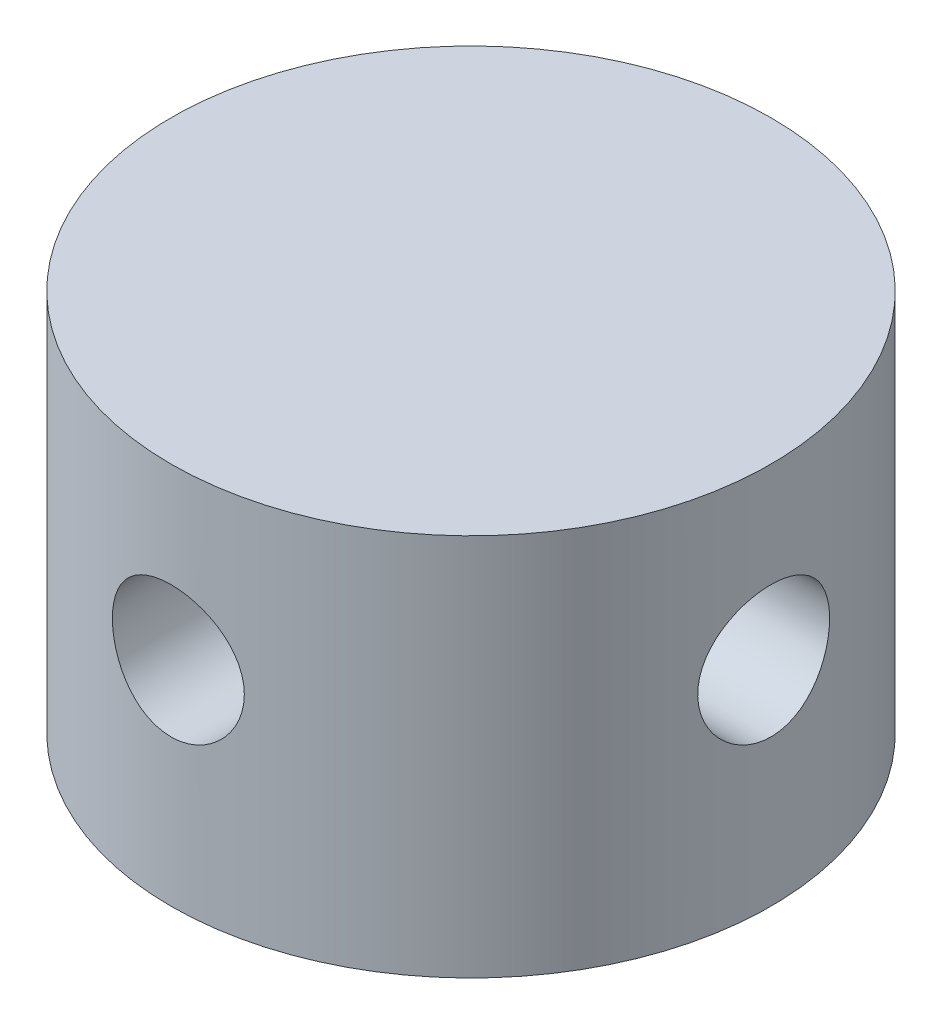
ISO-10303-21;
HEADER;
FILE_DESCRIPTION(('STEP AP214'),'2;1');
FILE_NAME('part.step','',(''),(''),'','','');
FILE_SCHEMA(('AUTOMOTIVE_DESIGN { 1 0 10303 214 1 1 1 1 }'));
ENDSEC;
DATA;
#1=APPLICATION_CONTEXT('core data for automotive mechanical design processes');
#2=APPLICATION_PROTOCOL_DEFINITION('international standard','automotive_design',2000,#1);
#3=PRODUCT_CONTEXT('',#1,'mechanical');
#4=PRODUCT('Part','Part','',(#3));
#5=PRODUCT_RELATED_PRODUCT_CATEGORY('part','',(#4));
#6=PRODUCT_DEFINITION_FORMATION('','',#4);
#7=PRODUCT_DEFINITION_CONTEXT('part definition',#1,'design');
#8=PRODUCT_DEFINITION('design','',#6,#7);
#9=PRODUCT_DEFINITION_SHAPE('','',#8);
#10=(LENGTH_UNIT() NAMED_UNIT(*) SI_UNIT(.MILLI.,.METRE.));
#11=(NAMED_UNIT(*) PLANE_ANGLE_UNIT() SI_UNIT($,.RADIAN.));
#12=(NAMED_UNIT(*) SI_UNIT($,.STERADIAN.) SOLID_ANGLE_UNIT());
#13=UNCERTAINTY_MEASURE_WITH_UNIT(LENGTH_MEASURE(1.E-05),#10,'distance_accuracy_value','');
#14=(GEOMETRIC_REPRESENTATION_CONTEXT(3) GLOBAL_UNCERTAINTY_ASSIGNED_CONTEXT((#13)) GLOBAL_UNIT_ASSIGNED_CONTEXT((#10,
#11,#12)) REPRESENTATION_CONTEXT('',''));
#15=CARTESIAN_POINT('',(0.,0.,0.));
#16=DIRECTION('',(0.,0.,1.));
#17=DIRECTION('',(1.,0.,0.));
#18=AXIS2_PLACEMENT_3D('',#15,#16,#17);
#19=CARTESIAN_POINT('',(0.,18.,0.));
#20=DIRECTION('',(0.,-1.,0.));
#21=DIRECTION('',(0.,0.,-1.));
#22=AXIS2_PLACEMENT_3D('',#19,#20,#21);
#23=CYLINDRICAL_SURFACE('',#22,14.1);
#24=CARTESIAN_POINT('',(3.09999999999995,9.99536264570849,13.7549990912395));
#25=CARTESIAN_POINT('',(3.09999411992978,9.82350746905944,13.7550025645096));
#26=CARTESIAN_POINT('',(3.08566065081584,9.65158181903695,13.7582549156995));
#27=CARTESIAN_POINT('',(3.02876920659056,9.3126213978908,13.7708886865632));
#28=CARTESIAN_POINT('',(2.98619096245082,9.14559022909433,13.7802745076685));
#29=CARTESIAN_POINT('',(2.87421678731367,8.82137098291792,13.8040620089077));
#30=CARTESIAN_POINT('',(2.80485045676283,8.66417226282665,13.8184581509814));
#31=CARTESIAN_POINT('',(2.64135406815421,8.3636395515444,13.8506375385802));
#32=CARTESIAN_POINT('',(2.54722446606408,8.22030530513245,13.8684207217379));
#33=CARTESIAN_POINT('',(2.33516105701524,7.94912198791013,13.9057095676612));
#34=CARTESIAN_POINT('',(2.2168844435982,7.82154399849603,13.9252374573557));
#35=CARTESIAN_POINT('',(1.96062442037141,7.58786928740143,13.9636208860314));
#36=CARTESIAN_POINT('',(1.82263947028193,7.48177424626149,13.9824763723176));
#37=CARTESIAN_POINT('',(1.52906082654924,7.29300353951631,14.0176326779998));
#38=CARTESIAN_POINT('',(1.37329555415371,7.21058879222852,14.0339042127536));
#39=CARTESIAN_POINT('',(1.04970870308235,7.07320646881902,14.0618081004196));
#40=CARTESIAN_POINT('',(0.881888494027424,7.01823578026641,14.0734409793716));
#41=CARTESIAN_POINT('',(0.541774438229651,6.93815511292983,14.0905997744071));
#42=CARTESIAN_POINT('',(0.369593436589872,6.9125862901946,14.0962194331246));
#43=CARTESIAN_POINT('',(0.0233002640244743,6.89060035151249,14.1010434578668));
#44=CARTESIAN_POINT('',(-0.150811681453886,6.89417986740183,14.1002485651092));
#45=CARTESIAN_POINT('',(-0.492860552600872,6.93004765789389,14.0924046293851));
#46=CARTESIAN_POINT('',(-0.660852177709911,6.96184133291502,14.0854633384897));
#47=CARTESIAN_POINT('',(-0.989055647430131,7.05244654404086,14.0662294023306));
#48=CARTESIAN_POINT('',(-1.14926713752524,7.11125931004489,14.0539365134654));
#49=CARTESIAN_POINT('',(-1.45873313752615,7.25466943493992,14.0252076372885));
#50=CARTESIAN_POINT('',(-1.6078980588268,7.3394538814269,14.0087417433553));
#51=CARTESIAN_POINT('',(-1.89006320955216,7.5322610596118,13.9734716605152));
#52=CARTESIAN_POINT('',(-2.02306121163649,7.64028698765707,13.954667150134));
#53=CARTESIAN_POINT('',(-2.27205912383892,7.87920200736506,13.9163204412336));
#54=CARTESIAN_POINT('',(-2.3876429603526,8.01052396047323,13.896771045125));
#55=CARTESIAN_POINT('',(-2.59522551407852,8.2908895026313,13.8595079162539));
#56=CARTESIAN_POINT('',(-2.68722357850058,8.4399335820145,13.841794234307));
#57=CARTESIAN_POINT('',(-2.84521072787002,8.75219011473823,13.8101888934495));
#58=CARTESIAN_POINT('',(-2.91112045202937,8.91544398454529,13.7963089348492));
#59=CARTESIAN_POINT('',(-3.01444437490898,9.25108792748183,13.7741042204203));
#60=CARTESIAN_POINT('',(-3.05186314580376,9.42347652993534,13.7657785732729));
#61=CARTESIAN_POINT('',(-3.09649608108288,9.76869267791968,13.7558071154172));
#62=CARTESIAN_POINT('',(-3.10431640026352,9.94143807402838,13.7540272731805));
#63=CARTESIAN_POINT('',(-3.0911721661921,10.2857643271728,13.7569872761586));
#64=CARTESIAN_POINT('',(-3.07020961254415,10.4573452642736,13.7617266684691));
#65=CARTESIAN_POINT('',(-3.00062079433947,10.7923566907622,13.7770644979956));
#66=CARTESIAN_POINT('',(-2.95232903572702,10.9558602095,13.7875920453895));
#67=CARTESIAN_POINT('',(-2.82981511824617,11.2724550765482,13.8132559309797));
#68=CARTESIAN_POINT('',(-2.75559045624442,11.4255454180381,13.8283927140573));
#69=CARTESIAN_POINT('',(-2.58198452157466,11.7195895355812,13.8618635923069));
#70=CARTESIAN_POINT('',(-2.48223022157287,11.8603177258924,13.8802437204791));
#71=CARTESIAN_POINT('',(-2.26088420495545,12.1232593707636,13.9180092019454));
#72=CARTESIAN_POINT('',(-2.13928974693735,12.2454704974857,13.9373946812148));
#73=CARTESIAN_POINT('',(-1.87497074612182,12.4702651599714,13.975428852107));
#74=CARTESIAN_POINT('',(-1.7318910619015,12.572435225996,13.994056763232));
#75=CARTESIAN_POINT('',(-1.43024752478873,12.7512891802791,14.0280930395516));
#76=CARTESIAN_POINT('',(-1.27168439945086,12.8279742653116,14.0435015559163));
#77=CARTESIAN_POINT('',(-0.944567991158111,12.9531073789012,14.069275375524));
#78=CARTESIAN_POINT('',(-0.776086173026157,13.001735322924,14.0796727401135));
#79=CARTESIAN_POINT('',(-0.43309015269698,13.0699350115161,14.0943914435328));
#80=CARTESIAN_POINT('',(-0.258576840886444,13.0895110262266,14.0987136752992));
#81=CARTESIAN_POINT('',(0.0876046700024358,13.0988575091693,14.1007682619989));
#82=CARTESIAN_POINT('',(0.259255689059971,13.0892450476252,14.0986370510955));
#83=CARTESIAN_POINT('',(0.598431940291955,13.0418688251846,14.0883168803137));
#84=CARTESIAN_POINT('',(0.765957248072582,13.0041055805653,14.0801280315307));
#85=CARTESIAN_POINT('',(1.09164358500725,12.9017967513608,14.0586231715158));
#86=CARTESIAN_POINT('',(1.2498335570684,12.8373395184742,14.0453240845184));
#87=CARTESIAN_POINT('',(1.55323484095157,12.6835582438099,14.0150181722923));
#88=CARTESIAN_POINT('',(1.69844487706199,12.5942317613412,13.9980109831827));
#89=CARTESIAN_POINT('',(1.9747714825509,12.3912399850654,13.9617366823329));
#90=CARTESIAN_POINT('',(2.10556481223626,12.2771412567439,13.9424325219723));
#91=CARTESIAN_POINT('',(2.3463592071959,12.0287170021513,13.9039383823843));
#92=CARTESIAN_POINT('',(2.45635524609736,11.8943866002652,13.8847484318422));
#93=CARTESIAN_POINT('',(2.65386864398921,11.6071245511426,13.8483656087781));
#94=CARTESIAN_POINT('',(2.74106145435619,11.4539656573861,13.8312032969471));
#95=CARTESIAN_POINT('',(2.88833154979412,11.1348232353738,13.8012040235434));
#96=CARTESIAN_POINT('',(2.94843167693091,10.9688506492689,13.7883634206256));
#97=CARTESIAN_POINT('',(3.02914022498018,10.6681632279682,13.7708231925498));
#98=CARTESIAN_POINT('',(3.05566145355524,10.5350735935094,13.7649287114634));
#99=CARTESIAN_POINT('',(3.09109322231865,10.2664580587699,13.7570153872435));
#100=CARTESIAN_POINT('',(3.10000463855072,10.1309322800198,13.7549963513165));
#101=CARTESIAN_POINT('',(3.09999999999995,9.99536264570849,13.7549990912395));
#102=B_SPLINE_CURVE_WITH_KNOTS('',3,(#24,#25,#26,#27,#28,#29,#30,#31,#32,#33,#34,#35,#36,#37,
#38,#39,#40,#41,#42,#43,#44,#45,#46,#47,#48,#49,#50,#51,#52,#53,#54,#55,#56,#57,#58,#59,#60,#61,
#62,#63,#64,#65,#66,#67,#68,#69,#70,#71,#72,#73,#74,#75,#76,#77,#78,#79,#80,#81,#82,#83,#84,#85,
#86,#87,#88,#89,#90,#91,#92,#93,#94,#95,#96,#97,#98,#99,#100,#101),.UNSPECIFIED.,.T.,.F.,(4,2,2,
2,2,2,2,2,2,2,2,2,2,2,2,2,2,2,2,2,2,2,2,2,2,2,2,2,2,2,2,2,2,2,2,2,2,2,4),(0.,0.515068644517524,
1.03050731326753,1.5453780519499,2.06023931094908,2.58299362175246,3.10578881012546,
3.63414094370786,4.16243314325175,4.68236390582046,5.20223458993589,5.71316800664553,
6.22412468316589,6.73885223026341,7.25365061195534,7.77927027944176,8.30490449308471,
8.8321256196768,9.35926212097256,9.87554294031489,10.3917878944041,10.9018466552336,
11.4119546623028,11.9299901549215,12.4480907174668,12.9759588713052,13.5038022329645,
14.0282220816238,14.5525648418152,15.0659002615969,15.5792262671831,16.0908666767041,
16.6025573167954,17.124049384305,17.6456673274559,18.1743484190628,18.702582937765,
19.1089200825321,19.5152370125427),.UNSPECIFIED.);
#103=CARTESIAN_POINT('',(3.09999999999995,9.99536264570849,13.7549990912395));
#104=VERTEX_POINT('',#103);
#105=EDGE_CURVE('E10',#104,#104,#102,.T.);
#106=ORIENTED_EDGE('',*,*,#105,.T.);
#107=EDGE_LOOP('',(#106));
#108=FACE_BOUND('',#107,.T.);
#109=CARTESIAN_POINT('',(-13.7549990912395,9.99536264570849,3.1));
#110=CARTESIAN_POINT('',(-13.7550025645096,9.82350746905944,3.09999411992983));
#111=CARTESIAN_POINT('',(-13.7582549156995,9.65158181903695,3.08566065081589));
#112=CARTESIAN_POINT('',(-13.7708886865632,9.3126213978908,3.02876920659061));
#113=CARTESIAN_POINT('',(-13.7802745076684,9.14559022909433,2.98619096245087));
#114=CARTESIAN_POINT('',(-13.8040620089077,8.82137098291792,2.87421678731372));
#115=CARTESIAN_POINT('',(-13.8184581509813,8.66417226282665,2.80485045676288));
#116=CARTESIAN_POINT('',(-13.8506375385802,8.3636395515444,2.64135406815426));
#117=CARTESIAN_POINT('',(-13.8684207217379,8.22030530513245,2.54722446606413));
#118=CARTESIAN_POINT('',(-13.9057095676612,7.94912198791013,2.33516105701529));
#119=CARTESIAN_POINT('',(-13.9252374573557,7.82154399849603,2.21688444359825));
#120=CARTESIAN_POINT('',(-13.9636208860313,7.58786928740143,1.96062442037146));
#121=CARTESIAN_POINT('',(-13.9824763723176,7.48177424626149,1.82263947028198));
#122=CARTESIAN_POINT('',(-14.0176326779998,7.29300353951631,1.52906082654929));
#123=CARTESIAN_POINT('',(-14.0339042127536,7.21058879222852,1.37329555415375));
#124=CARTESIAN_POINT('',(-14.0618081004196,7.07320646881902,1.0497087030824));
#125=CARTESIAN_POINT('',(-14.0734409793716,7.01823578026641,0.881888494027473));
#126=CARTESIAN_POINT('',(-14.0905997744071,6.93815511292983,0.541774438229701));
#127=CARTESIAN_POINT('',(-14.0962194331246,6.9125862901946,0.369593436589921));
#128=CARTESIAN_POINT('',(-14.1010434578668,6.89060035151249,0.0233002640245235));
#129=CARTESIAN_POINT('',(-14.1002485651092,6.89417986740183,-0.150811681453837));
#130=CARTESIAN_POINT('',(-14.0924046293851,6.93004765789389,-0.492860552600823));
#131=CARTESIAN_POINT('',(-14.0854633384897,6.96184133291502,-0.660852177709862));
#132=CARTESIAN_POINT('',(-14.0662294023306,7.05244654404086,-0.989055647430082));
#133=CARTESIAN_POINT('',(-14.0539365134654,7.11125931004489,-1.1492671375252));
#134=CARTESIAN_POINT('',(-14.0252076372885,7.25466943493992,-1.4587331375261));
#135=CARTESIAN_POINT('',(-14.0087417433553,7.3394538814269,-1.60789805882675));
#136=CARTESIAN_POINT('',(-13.9734716605152,7.5322610596118,-1.89006320955211));
#137=CARTESIAN_POINT('',(-13.954667150134,7.64028698765707,-2.02306121163644));
#138=CARTESIAN_POINT('',(-13.9163204412336,7.87920200736506,-2.27205912383887));
#139=CARTESIAN_POINT('',(-13.896771045125,8.01052396047323,-2.38764296035255));
#140=CARTESIAN_POINT('',(-13.8595079162539,8.2908895026313,-2.59522551407848));
#141=CARTESIAN_POINT('',(-13.8417942343071,8.4399335820145,-2.68722357850053));
#142=CARTESIAN_POINT('',(-13.8101888934496,8.75219011473823,-2.84521072786997));
#143=CARTESIAN_POINT('',(-13.7963089348492,8.91544398454529,-2.91112045202932));
#144=CARTESIAN_POINT('',(-13.7741042204203,9.25108792748183,-3.01444437490893));
#145=CARTESIAN_POINT('',(-13.7657785732729,9.42347652993533,-3.05186314580371));
#146=CARTESIAN_POINT('',(-13.7558071154172,9.76869267791967,-3.09649608108283));
#147=CARTESIAN_POINT('',(-13.7540272731805,9.94143807402838,-3.10431640026347));
#148=CARTESIAN_POINT('',(-13.7569872761586,10.2857643271728,-3.09117216619205));
#149=CARTESIAN_POINT('',(-13.7617266684691,10.4573452642736,-3.0702096125441));
#150=CARTESIAN_POINT('',(-13.7770644979956,10.7923566907622,-3.00062079433942));
#151=CARTESIAN_POINT('',(-13.7875920453895,10.9558602095,-2.95232903572697));
#152=CARTESIAN_POINT('',(-13.8132559309797,11.2724550765482,-2.82981511824612));
#153=CARTESIAN_POINT('',(-13.8283927140573,11.4255454180381,-2.75559045624437));
#154=CARTESIAN_POINT('',(-13.8618635923069,11.7195895355812,-2.58198452157461));
#155=CARTESIAN_POINT('',(-13.8802437204792,11.8603177258924,-2.48223022157282));
#156=CARTESIAN_POINT('',(-13.9180092019454,12.1232593707636,-2.2608842049554));
#157=CARTESIAN_POINT('',(-13.9373946812148,12.2454704974857,-2.1392897469373));
#158=CARTESIAN_POINT('',(-13.975428852107,12.4702651599714,-1.87497074612178));
#159=CARTESIAN_POINT('',(-13.994056763232,12.572435225996,-1.73189106190145));
#160=CARTESIAN_POINT('',(-14.0280930395516,12.7512891802791,-1.43024752478869));
#161=CARTESIAN_POINT('',(-14.0435015559163,12.8279742653116,-1.27168439945081));
#162=CARTESIAN_POINT('',(-14.069275375524,12.9531073789012,-0.944567991158062));
#163=CARTESIAN_POINT('',(-14.0796727401135,13.001735322924,-0.776086173026107));
#164=CARTESIAN_POINT('',(-14.0943914435328,13.0699350115161,-0.433090152696931));
#165=CARTESIAN_POINT('',(-14.0987136752992,13.0895110262266,-0.258576840886395));
#166=CARTESIAN_POINT('',(-14.1007682619989,13.0988575091693,0.0876046700024848));
#167=CARTESIAN_POINT('',(-14.0986370510955,13.0892450476252,0.25925568906002));
#168=CARTESIAN_POINT('',(-14.0883168803137,13.0418688251846,0.598431940292004));
#169=CARTESIAN_POINT('',(-14.0801280315307,13.0041055805653,0.765957248072631));
#170=CARTESIAN_POINT('',(-14.0586231715158,12.9017967513608,1.09164358500729));
#171=CARTESIAN_POINT('',(-14.0453240845184,12.8373395184742,1.24983355706845));
#172=CARTESIAN_POINT('',(-14.0150181722923,12.6835582438099,1.55323484095162));
#173=CARTESIAN_POINT('',(-13.9980109831827,12.5942317613412,1.69844487706204));
#174=CARTESIAN_POINT('',(-13.9617366823329,12.3912399850654,1.97477148255095));
#175=CARTESIAN_POINT('',(-13.9424325219723,12.2771412567439,2.10556481223631));
#176=CARTESIAN_POINT('',(-13.9039383823843,12.0287170021513,2.34635920719595));
#177=CARTESIAN_POINT('',(-13.8847484318422,11.8943866002652,2.45635524609741));
#178=CARTESIAN_POINT('',(-13.8483656087781,11.6071245511426,2.65386864398925));
#179=CARTESIAN_POINT('',(-13.8312032969471,11.4539656573861,2.74106145435624));
#180=CARTESIAN_POINT('',(-13.8012040235434,11.1348232353738,2.88833154979417));
#181=CARTESIAN_POINT('',(-13.7883634206256,10.9688506492689,2.94843167693096));
#182=CARTESIAN_POINT('',(-13.7708231925498,10.6681632279682,3.02914022498023));
#183=CARTESIAN_POINT('',(-13.7649287114634,10.5350735935094,3.05566145355529));
#184=CARTESIAN_POINT('',(-13.7570153872435,10.2664580587699,3.09109322231869));
#185=CARTESIAN_POINT('',(-13.7549963513165,10.1309322800198,3.10000463855077));
#186=CARTESIAN_POINT('',(-13.7549990912395,9.99536264570849,3.1));
#187=B_SPLINE_CURVE_WITH_KNOTS('',3,(#109,#110,#111,#112,#113,#114,#115,#116,#117,#118,#119,
#120,#121,#122,#123,#124,#125,#126,#127,#128,#129,#130,#131,#132,#133,#134,#135,#136,#137,#138,
#139,#140,#141,#142,#143,#144,#145,#146,#147,#148,#149,#150,#151,#152,#153,#154,#155,#156,#157,
#158,#159,#160,#161,#162,#163,#164,#165,#166,#167,#168,#169,#170,#171,#172,#173,#174,#175,#176,
#177,#178,#179,#180,#181,#182,#183,#184,#185,#186),.UNSPECIFIED.,.T.,.F.,(4,2,2,2,2,2,2,2,2,2,2,
2,2,2,2,2,2,2,2,2,2,2,2,2,2,2,2,2,2,2,2,2,2,2,2,2,2,2,4),(0.,0.515068644517522,1.03050731326753,
1.5453780519499,2.06023931094908,2.58299362175246,3.10578881012546,3.63414094370786,
4.16243314325175,4.68236390582047,5.20223458993589,5.71316800664554,6.22412468316589,
6.73885223026341,7.25365061195534,7.77927027944176,8.30490449308471,8.8321256196768,
9.35926212097256,9.87554294031489,10.3917878944041,10.9018466552336,11.4119546623028,
11.9299901549215,12.4480907174668,12.9759588713052,13.5038022329645,14.0282220816238,
14.5525648418152,15.0659002615969,15.5792262671831,16.0908666767041,16.6025573167954,
17.124049384305,17.6456673274559,18.1743484190628,18.702582937765,19.1089200825321,
19.5152370125427),.UNSPECIFIED.);
#188=CARTESIAN_POINT('',(-13.7549990912395,9.99536264570849,3.1));
#189=VERTEX_POINT('',#188);
#190=EDGE_CURVE('E41',#189,#189,#187,.T.);
#191=ORIENTED_EDGE('',*,*,#190,.T.);
#192=EDGE_LOOP('',(#191));
#193=FACE_BOUND('',#192,.T.);
#194=CARTESIAN_POINT('',(0.,13.0953626457085,-14.1));
#195=CARTESIAN_POINT('',(-0.171911786615108,13.0953568059468,-14.0999968323258));
#196=CARTESIAN_POINT('',(-0.343893947198078,13.081014213384,-14.0968240660357));
#197=CARTESIAN_POINT('',(-0.682971669483487,13.0240832497662,-14.0844737588774));
#198=CARTESIAN_POINT('',(-0.850063676057095,12.9814748372291,-14.0752919574498));
#199=CARTESIAN_POINT('',(-1.17441183370829,12.8694124783989,-14.0519457119919));
#200=CARTESIAN_POINT('',(-1.33167811142472,12.7999867192127,-14.0377865010051));
#201=CARTESIAN_POINT('',(-1.63232492550626,12.6363501996226,-14.0060129205543));
#202=CARTESIAN_POINT('',(-1.77570579221036,12.5421400290471,-13.9883986333182));
#203=CARTESIAN_POINT('',(-2.04684026273476,12.3299936417108,-13.9513248137297));
#204=CARTESIAN_POINT('',(-2.17433667952993,12.2117327319694,-13.9318421986679));
#205=CARTESIAN_POINT('',(-2.40785287252169,11.9555388491121,-13.893389856565));
#206=CARTESIAN_POINT('',(-2.51387071792781,11.8176041093383,-13.8744201757662));
#207=CARTESIAN_POINT('',(-2.70255757482361,11.5240732080705,-13.8389137581361));
#208=CARTESIAN_POINT('',(-2.7849523191605,11.3682968464119,-13.822406589992));
#209=CARTESIAN_POINT('',(-2.92229464978153,11.0446860774302,-13.7940256936242));
#210=CARTESIAN_POINT('',(-2.97724555447733,10.876853130755,-13.7821514052472));
#211=CARTESIAN_POINT('',(-3.05728944012302,10.5366845442548,-13.7646158695125));
#212=CARTESIAN_POINT('',(-3.0828380212479,10.3644610963717,-13.7588599263268));
#213=CARTESIAN_POINT('',(-3.10476874604689,10.0180836626389,-13.7539284182039));
#214=CARTESIAN_POINT('',(-3.10115451326537,9.84392991931794,-13.7547520357414));
#215=CARTESIAN_POINT('',(-3.06522873902715,9.50202602833064,-13.7628008778901));
#216=CARTESIAN_POINT('',(-3.03344691686435,9.3342170161258,-13.7699079303076));
#217=CARTESIAN_POINT('',(-2.94292756595208,9.0063725106585,-13.789535970011));
#218=CARTESIAN_POINT('',(-2.8841885108161,8.84633745814475,-13.8020572638626));
#219=CARTESIAN_POINT('',(-2.74093688564856,8.53709686553485,-13.8312191283426));
#220=CARTESIAN_POINT('',(-2.65622102281994,8.38798866986133,-13.8478919881604));
#221=CARTESIAN_POINT('',(-2.46356347142533,8.10590852529535,-13.8834586233418));
#222=CARTESIAN_POINT('',(-2.35561858580786,7.97293880151319,-13.9023527042535));
#223=CARTESIAN_POINT('',(-2.11676513611293,7.72386083173489,-13.9407396030881));
#224=CARTESIAN_POINT('',(-1.98540624728893,7.60818462061463,-13.9602364816651));
#225=CARTESIAN_POINT('',(-1.70493256270692,7.40043273665975,-13.9972562434288));
#226=CARTESIAN_POINT('',(-1.5558174388848,7.30835749997574,-14.0147790901316));
#227=CARTESIAN_POINT('',(-1.2435337531896,7.15031274644322,-14.0459342451259));
#228=CARTESIAN_POINT('',(-1.08033540316114,7.0844003014351,-14.0595580301037));
#229=CARTESIAN_POINT('',(-0.744813233843539,6.98105432477492,-14.0813167336323));
#230=CARTESIAN_POINT('',(-0.57249075960767,6.94361660789021,-14.0894524588017));
#231=CARTESIAN_POINT('',(-0.227317399294019,6.89891226321511,-14.099203399852));
#232=CARTESIAN_POINT('',(-0.05454643910947,6.89105553483807,-14.1009461289606));
#233=CARTESIAN_POINT('',(0.28983934681065,6.90413610336507,-14.0980722448798));
#234=CARTESIAN_POINT('',(0.461454251007571,6.92507142596196,-14.0934560677284));
#235=CARTESIAN_POINT('',(0.796697974674882,6.9946525916836,-14.0784635676515));
#236=CARTESIAN_POINT('',(0.960394260462611,7.04298850160827,-14.0681517026173));
#237=CARTESIAN_POINT('',(1.27735535966295,7.16565441069945,-14.0429222122385));
#238=CARTESIAN_POINT('',(1.43061927670358,7.23998664016714,-14.0280041917309));
#239=CARTESIAN_POINT('',(1.72480197945053,7.4137617266898,-13.9949029001729));
#240=CARTESIAN_POINT('',(1.86551126183526,7.51355069831645,-13.9766757109314));
#241=CARTESIAN_POINT('',(2.12839890229398,7.73495131674564,-13.9390668300814));
#242=CARTESIAN_POINT('',(2.25057482305518,7.85656582923068,-13.919684987091));
#243=CARTESIAN_POINT('',(2.47526403897258,8.1208743871797,-13.8815101776498));
#244=CARTESIAN_POINT('',(2.57736851745563,8.26391900139459,-13.8627349142389));
#245=CARTESIAN_POINT('',(2.7561074430838,8.56547204973907,-13.8283111873281));
#246=CARTESIAN_POINT('',(2.83274299594097,8.72397981216248,-13.8126625880985));
#247=CARTESIAN_POINT('',(2.95784856624058,9.05110777728202,-13.7864143742649));
#248=CARTESIAN_POINT('',(3.00647752746798,9.2196648001962,-13.77578633002));
#249=CARTESIAN_POINT('',(3.07465388541499,9.56282179676523,-13.760731983679));
#250=CARTESIAN_POINT('',(3.09420598812699,9.73742078786603,-13.7563046780209));
#251=CARTESIAN_POINT('',(3.10347172358849,10.083582298285,-13.7542167866646));
#252=CARTESIAN_POINT('',(3.09383371387461,10.2551268933197,-13.7564091642415));
#253=CARTESIAN_POINT('',(3.04644343852893,10.5940833960537,-13.7669808263706));
#254=CARTESIAN_POINT('',(3.0086915113334,10.7614953534768,-13.7753600364455));
#255=CARTESIAN_POINT('',(2.90645974367527,11.0869128903296,-13.7972891987861));
#256=CARTESIAN_POINT('',(2.84207519241618,11.2449497310822,-13.8108207030072));
#257=CARTESIAN_POINT('',(2.6884873309592,11.5480742911457,-13.8415368493112));
#258=CARTESIAN_POINT('',(2.59928140422691,11.6931606431555,-13.8587218764835));
#259=CARTESIAN_POINT('',(2.39643657025346,11.9694597842275,-13.895247300148));
#260=CARTESIAN_POINT('',(2.28233600636545,12.1003288423525,-13.9146245387731));
#261=CARTESIAN_POINT('',(2.03387515445769,12.3412751506989,-13.9531044896349));
#262=CARTESIAN_POINT('',(1.89951018648377,12.4513475847898,-13.9722071373372));
#263=CARTESIAN_POINT('',(1.61220729436672,12.6489614047946,-14.0082832676925));
#264=CARTESIAN_POINT('',(1.45904856374389,12.7361877999479,-14.0252254823412));
#265=CARTESIAN_POINT('',(1.13990272526399,12.8835207271952,-14.054757643892));
#266=CARTESIAN_POINT('',(0.973926459780788,12.9436498928142,-14.0673512210208));
#267=CARTESIAN_POINT('',(0.673165845322039,13.0244253789785,-14.0845330795902));
#268=CARTESIAN_POINT('',(0.540002650473667,13.0509758762241,-14.090297118704));
#269=CARTESIAN_POINT('',(0.271240834134558,13.0864464151151,-14.0980317428867));
#270=CARTESIAN_POINT('',(0.135642322970902,13.0953672534138,-14.1000024993672));
#271=CARTESIAN_POINT('',(0.,13.0953626457085,-14.1));
#272=B_SPLINE_CURVE_WITH_KNOTS('',3,(#194,#195,#196,#197,#198,#199,#200,#201,#202,#203,#204,
#205,#206,#207,#208,#209,#210,#211,#212,#213,#214,#215,#216,#217,#218,#219,#220,#221,#222,#223,
#224,#225,#226,#227,#228,#229,#230,#231,#232,#233,#234,#235,#236,#237,#238,#239,#240,#241,#242,
#243,#244,#245,#246,#247,#248,#249,#250,#251,#252,#253,#254,#255,#256,#257,#258,#259,#260,#261,
#262,#263,#264,#265,#266,#267,#268,#269,#270,#271),.UNSPECIFIED.,.T.,.F.,(4,2,2,2,2,2,2,2,2,2,2,
2,2,2,2,2,2,2,2,2,2,2,2,2,2,2,2,2,2,2,2,2,2,2,2,2,2,2,4),(0.,0.515238835222195,1.03084338431586,
1.54590746133927,2.06095928178934,2.58349095906344,3.10606958787551,3.63449015333107,
4.16284680856868,4.68290120959191,5.20289099369653,5.71330457570975,6.22374706219361,
6.73829084859945,7.25290549792135,7.77876740183102,8.30463902307048,8.83165156461373,
9.35858663056017,9.87495259929441,10.3912831619298,10.9018867255697,11.4125341061504,
11.9305333654534,12.4486006876236,12.9763216903251,13.5040197794679,14.0286927771071,
14.5532808489296,15.0663031015221,15.5793191784359,16.0905153910127,16.6017655115423,
17.1234536861385,17.6452625268044,18.173926452214,18.7021479778811,19.1087015493936,
19.5152367490471),.UNSPECIFIED.);
#273=CARTESIAN_POINT('',(0.,13.0953626457085,-14.1));
#274=VERTEX_POINT('',#273);
#275=EDGE_CURVE('E45',#274,#274,#272,.T.);
#276=ORIENTED_EDGE('',*,*,#275,.T.);
#277=EDGE_LOOP('',(#276));
#278=FACE_BOUND('',#277,.T.);
#279=CARTESIAN_POINT('',(13.7549990912395,9.99536264570849,-3.1));
#280=CARTESIAN_POINT('',(13.7550025645096,9.82350746905944,-3.09999411992983));
#281=CARTESIAN_POINT('',(13.7582549156995,9.65158181903695,-3.08566065081589));
#282=CARTESIAN_POINT('',(13.7708886865632,9.3126213978908,-3.02876920659061));
#283=CARTESIAN_POINT('',(13.7802745076684,9.14559022909433,-2.98619096245087));
#284=CARTESIAN_POINT('',(13.8040620089077,8.82137098291792,-2.87421678731372));
#285=CARTESIAN_POINT('',(13.8184581509813,8.66417226282665,-2.80485045676288));
#286=CARTESIAN_POINT('',(13.8506375385802,8.3636395515444,-2.64135406815426));
#287=CARTESIAN_POINT('',(13.8684207217379,8.22030530513245,-2.54722446606413));
#288=CARTESIAN_POINT('',(13.9057095676612,7.94912198791013,-2.33516105701529));
#289=CARTESIAN_POINT('',(13.9252374573557,7.82154399849603,-2.21688444359825));
#290=CARTESIAN_POINT('',(13.9636208860313,7.58786928740143,-1.96062442037146));
#291=CARTESIAN_POINT('',(13.9824763723176,7.48177424626149,-1.82263947028198));
#292=CARTESIAN_POINT('',(14.0176326779998,7.29300353951631,-1.52906082654929));
#293=CARTESIAN_POINT('',(14.0339042127536,7.21058879222852,-1.37329555415375));
#294=CARTESIAN_POINT('',(14.0618081004196,7.07320646881902,-1.0497087030824));
#295=CARTESIAN_POINT('',(14.0734409793716,7.01823578026641,-0.881888494027473));
#296=CARTESIAN_POINT('',(14.0905997744071,6.93815511292983,-0.541774438229701));
#297=CARTESIAN_POINT('',(14.0962194331246,6.9125862901946,-0.369593436589921));
#298=CARTESIAN_POINT('',(14.1010434578668,6.89060035151249,-0.0233002640245235));
#299=CARTESIAN_POINT('',(14.1002485651092,6.89417986740183,0.150811681453837));
#300=CARTESIAN_POINT('',(14.0924046293851,6.93004765789389,0.492860552600823));
#301=CARTESIAN_POINT('',(14.0854633384897,6.96184133291502,0.660852177709862));
#302=CARTESIAN_POINT('',(14.0662294023306,7.05244654404086,0.989055647430082));
#303=CARTESIAN_POINT('',(14.0539365134654,7.11125931004489,1.1492671375252));
#304=CARTESIAN_POINT('',(14.0252076372885,7.25466943493992,1.4587331375261));
#305=CARTESIAN_POINT('',(14.0087417433553,7.3394538814269,1.60789805882675));
#306=CARTESIAN_POINT('',(13.9734716605152,7.5322610596118,1.89006320955211));
#307=CARTESIAN_POINT('',(13.954667150134,7.64028698765707,2.02306121163644));
#308=CARTESIAN_POINT('',(13.9163204412336,7.87920200736506,2.27205912383887));
#309=CARTESIAN_POINT('',(13.896771045125,8.01052396047323,2.38764296035255));
#310=CARTESIAN_POINT('',(13.8595079162539,8.2908895026313,2.59522551407848));
#311=CARTESIAN_POINT('',(13.8417942343071,8.4399335820145,2.68722357850053));
#312=CARTESIAN_POINT('',(13.8101888934496,8.75219011473823,2.84521072786997));
#313=CARTESIAN_POINT('',(13.7963089348492,8.91544398454529,2.91112045202932));
#314=CARTESIAN_POINT('',(13.7741042204203,9.25108792748183,3.01444437490893));
#315=CARTESIAN_POINT('',(13.7657785732729,9.42347652993533,3.05186314580371));
#316=CARTESIAN_POINT('',(13.7558071154172,9.76869267791967,3.09649608108283));
#317=CARTESIAN_POINT('',(13.7540272731805,9.94143807402838,3.10431640026347));
#318=CARTESIAN_POINT('',(13.7569872761586,10.2857643271728,3.09117216619205));
#319=CARTESIAN_POINT('',(13.7617266684691,10.4573452642736,3.0702096125441));
#320=CARTESIAN_POINT('',(13.7770644979956,10.7923566907622,3.00062079433942));
#321=CARTESIAN_POINT('',(13.7875920453895,10.9558602095,2.95232903572697));
#322=CARTESIAN_POINT('',(13.8132559309797,11.2724550765482,2.82981511824612));
#323=CARTESIAN_POINT('',(13.8283927140573,11.4255454180381,2.75559045624437));
#324=CARTESIAN_POINT('',(13.8618635923069,11.7195895355812,2.58198452157461));
#325=CARTESIAN_POINT('',(13.8802437204792,11.8603177258924,2.48223022157282));
#326=CARTESIAN_POINT('',(13.9180092019454,12.1232593707636,2.2608842049554));
#327=CARTESIAN_POINT('',(13.9373946812148,12.2454704974857,2.1392897469373));
#328=CARTESIAN_POINT('',(13.975428852107,12.4702651599714,1.87497074612178));
#329=CARTESIAN_POINT('',(13.994056763232,12.572435225996,1.73189106190145));
#330=CARTESIAN_POINT('',(14.0280930395516,12.7512891802791,1.43024752478869));
#331=CARTESIAN_POINT('',(14.0435015559163,12.8279742653116,1.27168439945081));
#332=CARTESIAN_POINT('',(14.069275375524,12.9531073789012,0.944567991158062));
#333=CARTESIAN_POINT('',(14.0796727401135,13.001735322924,0.776086173026107));
#334=CARTESIAN_POINT('',(14.0943914435328,13.0699350115161,0.433090152696931));
#335=CARTESIAN_POINT('',(14.0987136752992,13.0895110262266,0.258576840886395));
#336=CARTESIAN_POINT('',(14.1007682619989,13.0988575091693,-0.0876046700024848));
#337=CARTESIAN_POINT('',(14.0986370510955,13.0892450476252,-0.25925568906002));
#338=CARTESIAN_POINT('',(14.0883168803137,13.0418688251846,-0.598431940292004));
#339=CARTESIAN_POINT('',(14.0801280315307,13.0041055805653,-0.765957248072631));
#340=CARTESIAN_POINT('',(14.0586231715158,12.9017967513608,-1.09164358500729));
#341=CARTESIAN_POINT('',(14.0453240845184,12.8373395184742,-1.24983355706845));
#342=CARTESIAN_POINT('',(14.0150181722923,12.6835582438099,-1.55323484095162));
#343=CARTESIAN_POINT('',(13.9980109831827,12.5942317613412,-1.69844487706204));
#344=CARTESIAN_POINT('',(13.9617366823329,12.3912399850654,-1.97477148255095));
#345=CARTESIAN_POINT('',(13.9424325219723,12.2771412567439,-2.10556481223631));
#346=CARTESIAN_POINT('',(13.9039383823843,12.0287170021513,-2.34635920719595));
#347=CARTESIAN_POINT('',(13.8847484318422,11.8943866002652,-2.45635524609741));
#348=CARTESIAN_POINT('',(13.8483656087781,11.6071245511426,-2.65386864398925));
#349=CARTESIAN_POINT('',(13.8312032969471,11.4539656573861,-2.74106145435624));
#350=CARTESIAN_POINT('',(13.8012040235434,11.1348232353738,-2.88833154979417));
#351=CARTESIAN_POINT('',(13.7883634206256,10.9688506492689,-2.94843167693096));
#352=CARTESIAN_POINT('',(13.7708231925498,10.6681632279682,-3.02914022498023));
#353=CARTESIAN_POINT('',(13.7649287114634,10.5350735935094,-3.05566145355529));
#354=CARTESIAN_POINT('',(13.7570153872435,10.2664580587699,-3.09109322231869));
#355=CARTESIAN_POINT('',(13.7549963513165,10.1309322800198,-3.10000463855077));
#356=CARTESIAN_POINT('',(13.7549990912395,9.99536264570849,-3.1));
#357=B_SPLINE_CURVE_WITH_KNOTS('',3,(#279,#280,#281,#282,#283,#284,#285,#286,#287,#288,#289,
#290,#291,#292,#293,#294,#295,#296,#297,#298,#299,#300,#301,#302,#303,#304,#305,#306,#307,#308,
#309,#310,#311,#312,#313,#314,#315,#316,#317,#318,#319,#320,#321,#322,#323,#324,#325,#326,#327,
#328,#329,#330,#331,#332,#333,#334,#335,#336,#337,#338,#339,#340,#341,#342,#343,#344,#345,#346,
#347,#348,#349,#350,#351,#352,#353,#354,#355,#356),.UNSPECIFIED.,.T.,.F.,(4,2,2,2,2,2,2,2,2,2,2,
2,2,2,2,2,2,2,2,2,2,2,2,2,2,2,2,2,2,2,2,2,2,2,2,2,2,2,4),(0.,0.515068644517522,1.03050731326753,
1.5453780519499,2.06023931094908,2.58299362175246,3.10578881012546,3.63414094370786,
4.16243314325175,4.68236390582047,5.20223458993589,5.71316800664554,6.22412468316589,
6.73885223026341,7.25365061195534,7.77927027944176,8.30490449308471,8.8321256196768,
9.35926212097256,9.87554294031489,10.3917878944041,10.9018466552336,11.4119546623028,
11.9299901549215,12.4480907174668,12.9759588713052,13.5038022329645,14.0282220816238,
14.5525648418152,15.0659002615969,15.5792262671831,16.0908666767041,16.6025573167954,
17.124049384305,17.6456673274559,18.1743484190628,18.702582937765,19.1089200825321,
19.5152370125427),.UNSPECIFIED.);
#358=CARTESIAN_POINT('',(13.7549990912395,9.99536264570849,-3.1));
#359=VERTEX_POINT('',#358);
#360=EDGE_CURVE('E49',#359,#359,#357,.T.);
#361=ORIENTED_EDGE('',*,*,#360,.T.);
#362=EDGE_LOOP('',(#361));
#363=FACE_BOUND('',#362,.T.);
#364=CARTESIAN_POINT('',(0.,18.,0.));
#365=DIRECTION('',(0.,1.,0.));
#366=DIRECTION('',(0.,0.,1.));
#367=AXIS2_PLACEMENT_3D('',#364,#365,#366);
#368=CIRCLE('',#367,14.1);
#369=CARTESIAN_POINT('',(0.,18.,14.1));
#370=VERTEX_POINT('',#369);
#371=EDGE_CURVE('E88',#370,#370,#368,.T.);
#372=ORIENTED_EDGE('',*,*,#371,.F.);
#373=EDGE_LOOP('',(#372));
#374=FACE_BOUND('',#373,.T.);
#375=CARTESIAN_POINT('',(0.,0.,0.));
#376=DIRECTION('',(0.,1.,0.));
#377=DIRECTION('',(0.,0.,1.));
#378=AXIS2_PLACEMENT_3D('',#375,#376,#377);
#379=CIRCLE('',#378,14.1);
#380=CARTESIAN_POINT('',(0.,0.,14.1));
#381=VERTEX_POINT('',#380);
#382=EDGE_CURVE('E89',#381,#381,#379,.T.);
#383=ORIENTED_EDGE('',*,*,#382,.T.);
#384=EDGE_LOOP('',(#383));
#385=FACE_BOUND('',#384,.T.);
#386=ADVANCED_FACE('F31',(#108,#193,#278,#363,#374,#385),#23,.T.);
#387=CARTESIAN_POINT('',(0.,18.,0.));
#388=DIRECTION('',(0.,1.,0.));
#389=DIRECTION('',(0.,0.,1.));
#390=AXIS2_PLACEMENT_3D('',#387,#388,#389);
#391=PLANE('',#390);
#392=ORIENTED_EDGE('',*,*,#371,.T.);
#393=EDGE_LOOP('',(#392));
#394=FACE_BOUND('',#393,.T.);
#395=ADVANCED_FACE('F83',(#394),#391,.T.);
#396=CARTESIAN_POINT('',(0.,0.,0.));
#397=DIRECTION('',(0.,1.,0.));
#398=DIRECTION('',(0.,0.,1.));
#399=AXIS2_PLACEMENT_3D('',#396,#397,#398);
#400=PLANE('',#399);
#401=ORIENTED_EDGE('',*,*,#382,.F.);
#402=EDGE_LOOP('',(#401));
#403=FACE_BOUND('',#402,.T.);
#404=ADVANCED_FACE('F81',(#403),#400,.F.);
#405=CARTESIAN_POINT('',(5.1,9.99536264570849,0.));
#406=DIRECTION('',(1.,0.,0.));
#407=DIRECTION('',(0.,0.,-1.));
#408=AXIS2_PLACEMENT_3D('',#405,#406,#407);
#409=CYLINDRICAL_SURFACE('',#408,3.1);
#410=CARTESIAN_POINT('',(5.1,9.99536264570849,0.));
#411=DIRECTION('',(1.,0.,0.));
#412=DIRECTION('',(0.,0.,-1.));
#413=AXIS2_PLACEMENT_3D('',#410,#411,#412);
#414=CIRCLE('',#413,3.1);
#415=CARTESIAN_POINT('',(5.1,9.99536264570849,-3.1));
#416=VERTEX_POINT('',#415);
#417=EDGE_CURVE('E92',#416,#416,#414,.T.);
#418=ORIENTED_EDGE('',*,*,#417,.F.);
#419=EDGE_LOOP('',(#418));
#420=FACE_BOUND('',#419,.T.);
#421=ORIENTED_EDGE('',*,*,#360,.F.);
#422=EDGE_LOOP('',(#421));
#423=FACE_BOUND('',#422,.T.);
#424=ADVANCED_FACE('F76',(#420,#423),#409,.F.);
#425=CARTESIAN_POINT('',(5.1,9.99536264570849,0.));
#426=DIRECTION('',(1.,0.,0.));
#427=DIRECTION('',(0.,0.,-1.));
#428=AXIS2_PLACEMENT_3D('',#425,#426,#427);
#429=PLANE('',#428);
#430=ORIENTED_EDGE('',*,*,#417,.T.);
#431=EDGE_LOOP('',(#430));
#432=FACE_BOUND('',#431,.T.);
#433=ADVANCED_FACE('F72',(#432),#429,.T.);
#434=CARTESIAN_POINT('',(0.,9.99536264570849,-5.1));
#435=DIRECTION('',(0.,0.,-1.));
#436=DIRECTION('',(-1.,0.,0.));
#437=AXIS2_PLACEMENT_3D('',#434,#435,#436);
#438=CYLINDRICAL_SURFACE('',#437,3.1);
#439=CARTESIAN_POINT('',(0.,9.99536264570849,-5.1));
#440=DIRECTION('',(0.,0.,-1.));
#441=DIRECTION('',(-1.,0.,0.));
#442=AXIS2_PLACEMENT_3D('',#439,#440,#441);
#443=CIRCLE('',#442,3.1);
#444=CARTESIAN_POINT('',(-3.09999999999995,9.99536264570849,-5.10000000000003));
#445=VERTEX_POINT('',#444);
#446=EDGE_CURVE('E98',#445,#445,#443,.T.);
#447=ORIENTED_EDGE('',*,*,#446,.F.);
#448=EDGE_LOOP('',(#447));
#449=FACE_BOUND('',#448,.T.);
#450=ORIENTED_EDGE('',*,*,#275,.F.);
#451=EDGE_LOOP('',(#450));
#452=FACE_BOUND('',#451,.T.);
#453=ADVANCED_FACE('F67',(#449,#452),#438,.F.);
#454=CARTESIAN_POINT('',(0.,9.99536264570849,-5.1));
#455=DIRECTION('',(0.,0.,-1.));
#456=DIRECTION('',(-1.,0.,0.));
#457=AXIS2_PLACEMENT_3D('',#454,#455,#456);
#458=PLANE('',#457);
#459=ORIENTED_EDGE('',*,*,#446,.T.);
#460=EDGE_LOOP('',(#459));
#461=FACE_BOUND('',#460,.T.);
#462=ADVANCED_FACE('F64',(#461),#458,.T.);
#463=CARTESIAN_POINT('',(-5.1,9.99536264570849,0.));
#464=DIRECTION('',(-1.,0.,0.));
#465=DIRECTION('',(0.,0.,1.));
#466=AXIS2_PLACEMENT_3D('',#463,#464,#465);
#467=CYLINDRICAL_SURFACE('',#466,3.1);
#468=CARTESIAN_POINT('',(-5.1,9.99536264570849,0.));
#469=DIRECTION('',(-1.,0.,0.));
#470=DIRECTION('',(0.,0.,1.));
#471=AXIS2_PLACEMENT_3D('',#468,#469,#470);
#472=CIRCLE('',#471,3.1);
#473=CARTESIAN_POINT('',(-5.1,9.99536264570849,3.1));
#474=VERTEX_POINT('',#473);
#475=EDGE_CURVE('E101',#474,#474,#472,.T.);
#476=ORIENTED_EDGE('',*,*,#475,.F.);
#477=EDGE_LOOP('',(#476));
#478=FACE_BOUND('',#477,.T.);
#479=ORIENTED_EDGE('',*,*,#190,.F.);
#480=EDGE_LOOP('',(#479));
#481=FACE_BOUND('',#480,.T.);
#482=ADVANCED_FACE('F58',(#478,#481),#467,.F.);
#483=CARTESIAN_POINT('',(-5.1,9.99536264570849,0.));
#484=DIRECTION('',(-1.,0.,0.));
#485=DIRECTION('',(0.,0.,1.));
#486=AXIS2_PLACEMENT_3D('',#483,#484,#485);
#487=PLANE('',#486);
#488=ORIENTED_EDGE('',*,*,#475,.T.);
#489=EDGE_LOOP('',(#488));
#490=FACE_BOUND('',#489,.T.);
#491=ADVANCED_FACE('F63',(#490),#487,.T.);
#492=CARTESIAN_POINT('',(0.,9.99536264570849,5.1));
#493=DIRECTION('',(0.,0.,1.));
#494=DIRECTION('',(1.,0.,0.));
#495=AXIS2_PLACEMENT_3D('',#492,#493,#494);
#496=CYLINDRICAL_SURFACE('',#495,3.1);
#497=CARTESIAN_POINT('',(0.,9.99536264570849,5.1));
#498=DIRECTION('',(0.,0.,1.));
#499=DIRECTION('',(1.,0.,0.));
#500=AXIS2_PLACEMENT_3D('',#497,#498,#499);
#501=CIRCLE('',#500,3.1);
#502=CARTESIAN_POINT('',(3.09999999999998,9.99536264570849,5.10000000000001));
#503=VERTEX_POINT('',#502);
#504=EDGE_CURVE('E97',#503,#503,#501,.T.);
#505=ORIENTED_EDGE('',*,*,#504,.F.);
#506=EDGE_LOOP('',(#505));
#507=FACE_BOUND('',#506,.T.);
#508=ORIENTED_EDGE('',*,*,#105,.F.);
#509=EDGE_LOOP('',(#508));
#510=FACE_BOUND('',#509,.T.);
#511=ADVANCED_FACE('F109',(#507,#510),#496,.F.);
#512=CARTESIAN_POINT('',(0.,9.99536264570849,5.1));
#513=DIRECTION('',(0.,0.,1.));
#514=DIRECTION('',(1.,0.,0.));
#515=AXIS2_PLACEMENT_3D('',#512,#513,#514);
#516=PLANE('',#515);
#517=ORIENTED_EDGE('',*,*,#504,.T.);
#518=EDGE_LOOP('',(#517));
#519=FACE_BOUND('',#518,.T.);
#520=ADVANCED_FACE('F107',(#519),#516,.T.);
#521=CLOSED_SHELL('',(#386,#395,#404,#424,#433,#453,#462,#482,#491,#511,#520));
#522=MANIFOLD_SOLID_BREP('B2',#521);
#523=ADVANCED_BREP_SHAPE_REPRESENTATION('',(#18,#522),#14);
#524=SHAPE_DEFINITION_REPRESENTATION(#9,#523);
ENDSEC;
END-ISO-10303-21;
